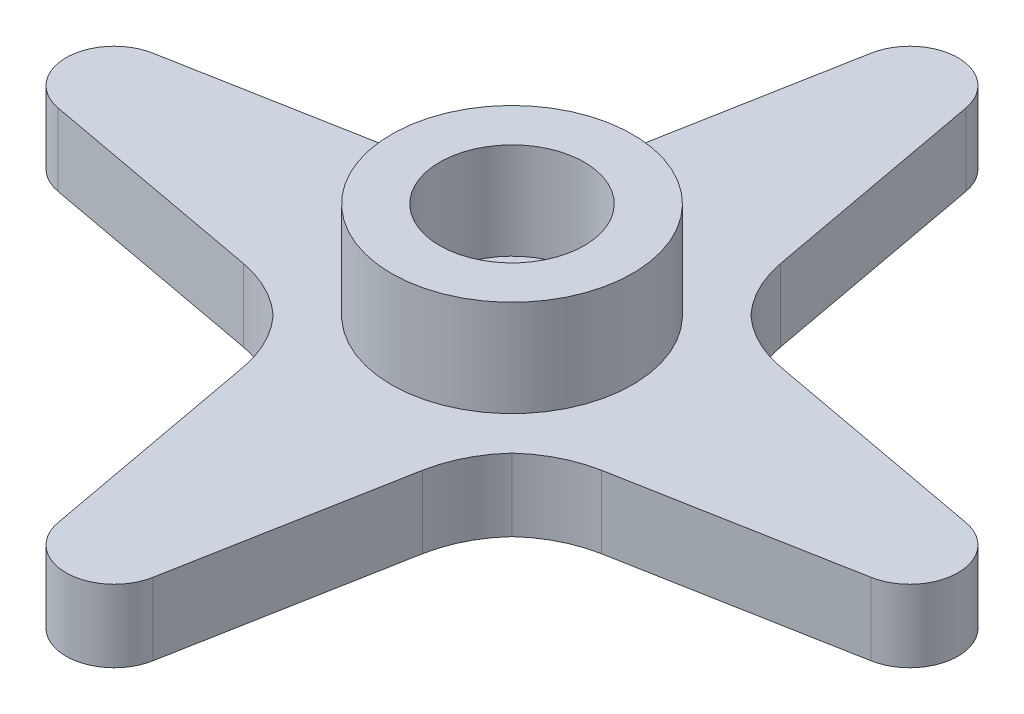
ISO-10303-21;
HEADER;
FILE_DESCRIPTION(('STEP AP214'),'2;1');
FILE_NAME('part.step','',(''),(''),'','','');
FILE_SCHEMA(('AUTOMOTIVE_DESIGN { 1 0 10303 214 1 1 1 1 }'));
ENDSEC;
DATA;
#1=APPLICATION_CONTEXT('core data for automotive mechanical design processes');
#2=APPLICATION_PROTOCOL_DEFINITION('international standard','automotive_design',2000,#1);
#3=PRODUCT_CONTEXT('',#1,'mechanical');
#4=PRODUCT('Part','Part','',(#3));
#5=PRODUCT_RELATED_PRODUCT_CATEGORY('part','',(#4));
#6=PRODUCT_DEFINITION_FORMATION('','',#4);
#7=PRODUCT_DEFINITION_CONTEXT('part definition',#1,'design');
#8=PRODUCT_DEFINITION('design','',#6,#7);
#9=PRODUCT_DEFINITION_SHAPE('','',#8);
#10=(LENGTH_UNIT() NAMED_UNIT(*) SI_UNIT(.MILLI.,.METRE.));
#11=(NAMED_UNIT(*) PLANE_ANGLE_UNIT() SI_UNIT($,.RADIAN.));
#12=(NAMED_UNIT(*) SI_UNIT($,.STERADIAN.) SOLID_ANGLE_UNIT());
#13=UNCERTAINTY_MEASURE_WITH_UNIT(LENGTH_MEASURE(1.E-05),#10,'distance_accuracy_value','');
#14=(GEOMETRIC_REPRESENTATION_CONTEXT(3) GLOBAL_UNCERTAINTY_ASSIGNED_CONTEXT((#13)) GLOBAL_UNIT_ASSIGNED_CONTEXT((#10,
#11,#12)) REPRESENTATION_CONTEXT('',''));
#15=CARTESIAN_POINT('',(0.,0.,0.));
#16=DIRECTION('',(0.,0.,1.));
#17=DIRECTION('',(1.,0.,0.));
#18=AXIS2_PLACEMENT_3D('',#15,#16,#17);
#19=CARTESIAN_POINT('',(-16.8636363636364,3.,-1.96666433207106));
#20=DIRECTION('',(0.181818181818182,0.,0.983332166035633));
#21=DIRECTION('',(0.983332166035634,0.,-0.181818181818182));
#22=AXIS2_PLACEMENT_3D('',#19,#20,#21);
#23=PLANE('',#22);
#24=DIRECTION('',(-0.983332166035634,0.,0.181818181818182));
#25=VECTOR('',#24,1.);
#26=CARTESIAN_POINT('',(-16.8636363636364,3.,-1.96666433207106));
#27=LINE('',#26,#25);
#28=CARTESIAN_POINT('',(-7.43177858714639,3.,-3.71061545186688));
#29=VERTEX_POINT('',#28);
#30=CARTESIAN_POINT('',(-16.8636363636364,3.,-1.96666433207099));
#31=VERTEX_POINT('',#30);
#32=EDGE_CURVE('E173',#29,#31,#27,.T.);
#33=ORIENTED_EDGE('',*,*,#32,.F.);
#34=DIRECTION('',(0.,1.,0.));
#35=VECTOR('',#34,1.);
#36=CARTESIAN_POINT('',(-7.43177858714639,0.,-3.71061545186688));
#37=LINE('',#36,#35);
#38=CARTESIAN_POINT('',(-7.43177858714639,0.,-3.71061545186688));
#39=VERTEX_POINT('',#38);
#40=EDGE_CURVE('E279',#29,#39,#37,.F.);
#41=ORIENTED_EDGE('',*,*,#40,.T.);
#42=DIRECTION('',(-0.983332166035634,0.,0.181818181818182));
#43=VECTOR('',#42,1.);
#44=CARTESIAN_POINT('',(-16.8636363636364,0.,-1.96666433207106));
#45=LINE('',#44,#43);
#46=CARTESIAN_POINT('',(-16.8636363636364,0.,-1.96666433207099));
#47=VERTEX_POINT('',#46);
#48=EDGE_CURVE('E191',#39,#47,#45,.T.);
#49=ORIENTED_EDGE('',*,*,#48,.T.);
#50=DIRECTION('',(0.,-1.,0.));
#51=VECTOR('',#50,1.);
#52=CARTESIAN_POINT('',(-16.8636363636364,3.,-1.96666433207099));
#53=LINE('',#52,#51);
#54=EDGE_CURVE('E189',#31,#47,#53,.T.);
#55=ORIENTED_EDGE('',*,*,#54,.F.);
#56=EDGE_LOOP('',(#33,#41,#49,#55));
#57=FACE_BOUND('',#56,.T.);
#58=ADVANCED_FACE('F37',(#57),#23,.F.);
#59=CARTESIAN_POINT('',(-16.5,3.,2.78852033508202E-13));
#60=DIRECTION('',(0.,-1.,0.));
#61=DIRECTION('',(0.,0.,-1.));
#62=AXIS2_PLACEMENT_3D('',#59,#60,#61);
#63=CYLINDRICAL_SURFACE('',#62,2.00000000000001);
#64=CARTESIAN_POINT('',(-16.5,0.,2.78852033508202E-13));
#65=DIRECTION('',(0.,1.,0.));
#66=DIRECTION('',(0.,0.,1.));
#67=AXIS2_PLACEMENT_3D('',#64,#65,#66);
#68=CIRCLE('',#67,2.00000000000001);
#69=CARTESIAN_POINT('',(-16.8636363636364,0.,1.96666433207147));
#70=VERTEX_POINT('',#69);
#71=EDGE_CURVE('E226',#47,#70,#68,.T.);
#72=ORIENTED_EDGE('',*,*,#71,.T.);
#73=DIRECTION('',(0.,-1.,0.));
#74=VECTOR('',#73,1.);
#75=CARTESIAN_POINT('',(-16.8636363636364,3.,1.96666433207147));
#76=LINE('',#75,#74);
#77=CARTESIAN_POINT('',(-16.8636363636364,3.,1.96666433207147));
#78=VERTEX_POINT('',#77);
#79=EDGE_CURVE('E195',#78,#70,#76,.T.);
#80=ORIENTED_EDGE('',*,*,#79,.F.);
#81=CARTESIAN_POINT('',(-16.5,3.,2.78852033508202E-13));
#82=DIRECTION('',(0.,1.,0.));
#83=DIRECTION('',(0.,0.,1.));
#84=AXIS2_PLACEMENT_3D('',#81,#82,#83);
#85=CIRCLE('',#84,2.00000000000001);
#86=EDGE_CURVE('E179',#31,#78,#85,.T.);
#87=ORIENTED_EDGE('',*,*,#86,.F.);
#88=ORIENTED_EDGE('',*,*,#54,.T.);
#89=EDGE_LOOP('',(#72,#80,#87,#88));
#90=FACE_BOUND('',#89,.T.);
#91=ADVANCED_FACE('F197',(#90),#63,.T.);
#92=CARTESIAN_POINT('',(-16.8636363636364,3.,1.96666433207147));
#93=DIRECTION('',(0.181818181818182,0.,-0.983332166035633));
#94=DIRECTION('',(-0.983332166035634,0.,-0.181818181818182));
#95=AXIS2_PLACEMENT_3D('',#92,#93,#94);
#96=PLANE('',#95);
#97=DIRECTION('',(0.983332166035634,0.,0.181818181818182));
#98=VECTOR('',#97,1.);
#99=CARTESIAN_POINT('',(-16.8636363636364,0.,1.96666433207147));
#100=LINE('',#99,#98);
#101=CARTESIAN_POINT('',(-7.43177858714611,0.,3.71061545186734));
#102=VERTEX_POINT('',#101);
#103=EDGE_CURVE('E229',#70,#102,#100,.T.);
#104=ORIENTED_EDGE('',*,*,#103,.T.);
#105=DIRECTION('',(0.,1.,0.));
#106=VECTOR('',#105,1.);
#107=CARTESIAN_POINT('',(-7.43177858714611,3.,3.71061545186734));
#108=LINE('',#107,#106);
#109=CARTESIAN_POINT('',(-7.43177858714611,3.,3.71061545186734));
#110=VERTEX_POINT('',#109);
#111=EDGE_CURVE('E277',#102,#110,#108,.T.);
#112=ORIENTED_EDGE('',*,*,#111,.T.);
#113=DIRECTION('',(0.983332166035634,0.,0.181818181818182));
#114=VECTOR('',#113,1.);
#115=CARTESIAN_POINT('',(-16.8636363636364,3.,1.96666433207147));
#116=LINE('',#115,#114);
#117=EDGE_CURVE('E200',#78,#110,#116,.T.);
#118=ORIENTED_EDGE('',*,*,#117,.F.);
#119=ORIENTED_EDGE('',*,*,#79,.T.);
#120=EDGE_LOOP('',(#104,#112,#118,#119));
#121=FACE_BOUND('',#120,.T.);
#122=ADVANCED_FACE('F352',(#121),#96,.F.);
#123=CARTESIAN_POINT('',(-1.96666433207099,3.,16.8636363636366));
#124=DIRECTION('',(0.983332166035633,0.,-0.181818181818182));
#125=DIRECTION('',(-0.181818181818182,0.,-0.983332166035634));
#126=AXIS2_PLACEMENT_3D('',#123,#124,#125);
#127=PLANE('',#126);
#128=DIRECTION('',(0.181818181818182,0.,0.983332166035633));
#129=VECTOR('',#128,1.);
#130=CARTESIAN_POINT('',(-1.96666433207099,3.,16.8636363636366));
#131=LINE('',#130,#129);
#132=CARTESIAN_POINT('',(-3.71061545186679,3.,7.43177858714668));
#133=VERTEX_POINT('',#132);
#134=CARTESIAN_POINT('',(-1.96666433207095,3.,16.8636363636366));
#135=VERTEX_POINT('',#134);
#136=EDGE_CURVE('E202',#133,#135,#131,.T.);
#137=ORIENTED_EDGE('',*,*,#136,.F.);
#138=DIRECTION('',(0.,1.,0.));
#139=VECTOR('',#138,1.);
#140=CARTESIAN_POINT('',(-3.71061545186679,0.,7.43177858714668));
#141=LINE('',#140,#139);
#142=CARTESIAN_POINT('',(-3.71061545186679,0.,7.43177858714668));
#143=VERTEX_POINT('',#142);
#144=EDGE_CURVE('E274',#133,#143,#141,.F.);
#145=ORIENTED_EDGE('',*,*,#144,.T.);
#146=DIRECTION('',(0.181818181818182,0.,0.983332166035633));
#147=VECTOR('',#146,1.);
#148=CARTESIAN_POINT('',(-1.96666433207099,0.,16.8636363636366));
#149=LINE('',#148,#147);
#150=CARTESIAN_POINT('',(-1.96666433207095,0.,16.8636363636366));
#151=VERTEX_POINT('',#150);
#152=EDGE_CURVE('E232',#143,#151,#149,.T.);
#153=ORIENTED_EDGE('',*,*,#152,.T.);
#154=DIRECTION('',(0.,-1.,0.));
#155=VECTOR('',#154,1.);
#156=CARTESIAN_POINT('',(-1.96666433207095,3.,16.8636363636366));
#157=LINE('',#156,#155);
#158=EDGE_CURVE('E266',#135,#151,#157,.T.);
#159=ORIENTED_EDGE('',*,*,#158,.F.);
#160=EDGE_LOOP('',(#137,#145,#153,#159));
#161=FACE_BOUND('',#160,.T.);
#162=ADVANCED_FACE('F366',(#161),#127,.F.);
#163=CARTESIAN_POINT('',(3.22944510274302E-13,3.,16.5000000000002));
#164=DIRECTION('',(0.,-1.,0.));
#165=DIRECTION('',(0.,0.,-1.));
#166=AXIS2_PLACEMENT_3D('',#163,#164,#165);
#167=CYLINDRICAL_SURFACE('',#166,2.);
#168=CARTESIAN_POINT('',(3.22944510274302E-13,0.,16.5000000000002));
#169=DIRECTION('',(0.,1.,0.));
#170=DIRECTION('',(0.,0.,1.));
#171=AXIS2_PLACEMENT_3D('',#168,#169,#170);
#172=CIRCLE('',#171,2.);
#173=CARTESIAN_POINT('',(1.96666433207155,0.,16.8636363636366));
#174=VERTEX_POINT('',#173);
#175=EDGE_CURVE('E234',#151,#174,#172,.T.);
#176=ORIENTED_EDGE('',*,*,#175,.T.);
#177=DIRECTION('',(0.,-1.,0.));
#178=VECTOR('',#177,1.);
#179=CARTESIAN_POINT('',(1.96666433207155,3.,16.8636363636366));
#180=LINE('',#179,#178);
#181=CARTESIAN_POINT('',(1.96666433207155,3.,16.8636363636366));
#182=VERTEX_POINT('',#181);
#183=EDGE_CURVE('E263',#182,#174,#180,.T.);
#184=ORIENTED_EDGE('',*,*,#183,.F.);
#185=CARTESIAN_POINT('',(3.22944510274302E-13,3.,16.5000000000002));
#186=DIRECTION('',(0.,1.,0.));
#187=DIRECTION('',(0.,0.,1.));
#188=AXIS2_PLACEMENT_3D('',#185,#186,#187);
#189=CIRCLE('',#188,2.);
#190=EDGE_CURVE('E207',#135,#182,#189,.T.);
#191=ORIENTED_EDGE('',*,*,#190,.F.);
#192=ORIENTED_EDGE('',*,*,#158,.T.);
#193=EDGE_LOOP('',(#176,#184,#191,#192));
#194=FACE_BOUND('',#193,.T.);
#195=ADVANCED_FACE('F372',(#194),#167,.T.);
#196=CARTESIAN_POINT('',(1.96666433207155,3.,16.8636363636366));
#197=DIRECTION('',(-0.983332166035639,0.,-0.181818181818151));
#198=DIRECTION('',(-0.181818181818151,0.,0.983332166035639));
#199=AXIS2_PLACEMENT_3D('',#196,#197,#198);
#200=PLANE('',#199);
#201=DIRECTION('',(0.181818181818151,0.,-0.983332166035639));
#202=VECTOR('',#201,1.);
#203=CARTESIAN_POINT('',(1.96666433207155,0.,16.8636363636366));
#204=LINE('',#203,#202);
#205=CARTESIAN_POINT('',(3.71061545186711,0.,7.43177858714634));
#206=VERTEX_POINT('',#205);
#207=EDGE_CURVE('E236',#174,#206,#204,.T.);
#208=ORIENTED_EDGE('',*,*,#207,.T.);
#209=DIRECTION('',(0.,1.,0.));
#210=VECTOR('',#209,1.);
#211=CARTESIAN_POINT('',(3.71061545186711,3.,7.43177858714634));
#212=LINE('',#211,#210);
#213=CARTESIAN_POINT('',(3.71061545186711,3.,7.43177858714634));
#214=VERTEX_POINT('',#213);
#215=EDGE_CURVE('E272',#206,#214,#212,.T.);
#216=ORIENTED_EDGE('',*,*,#215,.T.);
#217=DIRECTION('',(0.181818181818151,0.,-0.983332166035639));
#218=VECTOR('',#217,1.);
#219=CARTESIAN_POINT('',(1.96666433207155,3.,16.8636363636366));
#220=LINE('',#219,#218);
#221=EDGE_CURVE('E209',#182,#214,#220,.T.);
#222=ORIENTED_EDGE('',*,*,#221,.F.);
#223=ORIENTED_EDGE('',*,*,#183,.T.);
#224=EDGE_LOOP('',(#208,#216,#222,#223));
#225=FACE_BOUND('',#224,.T.);
#226=ADVANCED_FACE('F400',(#225),#200,.F.);
#227=CARTESIAN_POINT('',(16.8636363636364,3.,1.96666433207133));
#228=DIRECTION('',(-0.181818181818178,0.,-0.983332166035634));
#229=DIRECTION('',(-0.983332166035634,0.,0.181818181818178));
#230=AXIS2_PLACEMENT_3D('',#227,#228,#229);
#231=PLANE('',#230);
#232=DIRECTION('',(0.983332166035634,0.,-0.181818181818178));
#233=VECTOR('',#232,1.);
#234=CARTESIAN_POINT('',(16.8636363636364,3.,1.96666433207133));
#235=LINE('',#234,#233);
#236=CARTESIAN_POINT('',(7.4317785871462,3.,3.71061545186714));
#237=VERTEX_POINT('',#236);
#238=CARTESIAN_POINT('',(16.8636363636364,3.,1.96666433207133));
#239=VERTEX_POINT('',#238);
#240=EDGE_CURVE('E212',#237,#239,#235,.T.);
#241=ORIENTED_EDGE('',*,*,#240,.F.);
#242=DIRECTION('',(0.,1.,0.));
#243=VECTOR('',#242,1.);
#244=CARTESIAN_POINT('',(7.43177858714621,0.,3.71061545186714));
#245=LINE('',#244,#243);
#246=CARTESIAN_POINT('',(7.4317785871462,0.,3.71061545186714));
#247=VERTEX_POINT('',#246);
#248=EDGE_CURVE('E194',#237,#247,#245,.F.);
#249=ORIENTED_EDGE('',*,*,#248,.T.);
#250=DIRECTION('',(0.983332166035634,0.,-0.181818181818178));
#251=VECTOR('',#250,1.);
#252=CARTESIAN_POINT('',(16.8636363636364,0.,1.96666433207133));
#253=LINE('',#252,#251);
#254=CARTESIAN_POINT('',(16.8636363636364,0.,1.96666433207133));
#255=VERTEX_POINT('',#254);
#256=EDGE_CURVE('E239',#247,#255,#253,.T.);
#257=ORIENTED_EDGE('',*,*,#256,.T.);
#258=DIRECTION('',(0.,-1.,0.));
#259=VECTOR('',#258,1.);
#260=CARTESIAN_POINT('',(16.8636363636364,3.,1.96666433207133));
#261=LINE('',#260,#259);
#262=EDGE_CURVE('E260',#239,#255,#261,.T.);
#263=ORIENTED_EDGE('',*,*,#262,.F.);
#264=EDGE_LOOP('',(#241,#249,#257,#263));
#265=FACE_BOUND('',#264,.T.);
#266=ADVANCED_FACE('F388',(#265),#231,.F.);
#267=CARTESIAN_POINT('',(16.5,3.,0.));
#268=DIRECTION('',(0.,-1.,0.));
#269=DIRECTION('',(0.,0.,-1.));
#270=AXIS2_PLACEMENT_3D('',#267,#268,#269);
#271=CYLINDRICAL_SURFACE('',#270,2.);
#272=CARTESIAN_POINT('',(16.5,0.,0.));
#273=DIRECTION('',(0.,1.,0.));
#274=DIRECTION('',(0.,0.,1.));
#275=AXIS2_PLACEMENT_3D('',#272,#273,#274);
#276=CIRCLE('',#275,2.);
#277=CARTESIAN_POINT('',(16.8636363636364,0.,-1.96666433207121));
#278=VERTEX_POINT('',#277);
#279=EDGE_CURVE('E241',#255,#278,#276,.T.);
#280=ORIENTED_EDGE('',*,*,#279,.T.);
#281=DIRECTION('',(0.,-1.,0.));
#282=VECTOR('',#281,1.);
#283=CARTESIAN_POINT('',(16.8636363636364,3.,-1.96666433207121));
#284=LINE('',#283,#282);
#285=CARTESIAN_POINT('',(16.8636363636364,3.,-1.96666433207121));
#286=VERTEX_POINT('',#285);
#287=EDGE_CURVE('E257',#286,#278,#284,.T.);
#288=ORIENTED_EDGE('',*,*,#287,.F.);
#289=CARTESIAN_POINT('',(16.5,3.,0.));
#290=DIRECTION('',(0.,1.,0.));
#291=DIRECTION('',(0.,0.,1.));
#292=AXIS2_PLACEMENT_3D('',#289,#290,#291);
#293=CIRCLE('',#292,2.);
#294=EDGE_CURVE('E214',#239,#286,#293,.T.);
#295=ORIENTED_EDGE('',*,*,#294,.F.);
#296=ORIENTED_EDGE('',*,*,#262,.T.);
#297=EDGE_LOOP('',(#280,#288,#295,#296));
#298=FACE_BOUND('',#297,.T.);
#299=ADVANCED_FACE('F394',(#298),#271,.T.);
#300=CARTESIAN_POINT('',(16.8636363636364,3.,-1.96666433207121));
#301=DIRECTION('',(-0.181818181818185,0.,0.983332166035633));
#302=DIRECTION('',(0.983332166035633,0.,0.181818181818185));
#303=AXIS2_PLACEMENT_3D('',#300,#301,#302);
#304=PLANE('',#303);
#305=DIRECTION('',(-0.983332166035633,0.,-0.181818181818185));
#306=VECTOR('',#305,1.);
#307=CARTESIAN_POINT('',(16.8636363636364,0.,-1.96666433207121));
#308=LINE('',#307,#306);
#309=CARTESIAN_POINT('',(7.43177858714623,0.,-3.71061545186709));
#310=VERTEX_POINT('',#309);
#311=EDGE_CURVE('E243',#278,#310,#308,.T.);
#312=ORIENTED_EDGE('',*,*,#311,.T.);
#313=DIRECTION('',(0.,1.,0.));
#314=VECTOR('',#313,1.);
#315=CARTESIAN_POINT('',(7.43177858714623,3.,-3.71061545186709));
#316=LINE('',#315,#314);
#317=CARTESIAN_POINT('',(7.43177858714623,3.,-3.71061545186709));
#318=VERTEX_POINT('',#317);
#319=EDGE_CURVE('E283',#310,#318,#316,.T.);
#320=ORIENTED_EDGE('',*,*,#319,.T.);
#321=DIRECTION('',(-0.983332166035633,0.,-0.181818181818185));
#322=VECTOR('',#321,1.);
#323=CARTESIAN_POINT('',(16.8636363636364,3.,-1.96666433207121));
#324=LINE('',#323,#322);
#325=EDGE_CURVE('E216',#286,#318,#324,.T.);
#326=ORIENTED_EDGE('',*,*,#325,.F.);
#327=ORIENTED_EDGE('',*,*,#287,.T.);
#328=EDGE_LOOP('',(#312,#320,#326,#327));
#329=FACE_BOUND('',#328,.T.);
#330=ADVANCED_FACE('F397',(#329),#304,.F.);
#331=CARTESIAN_POINT('',(1.96666433207127,3.,-16.8636363636364));
#332=DIRECTION('',(-0.983332166035633,0.,0.181818181818182));
#333=DIRECTION('',(0.181818181818182,0.,0.983332166035634));
#334=AXIS2_PLACEMENT_3D('',#331,#332,#333);
#335=PLANE('',#334);
#336=DIRECTION('',(-0.181818181818182,0.,-0.983332166035634));
#337=VECTOR('',#336,1.);
#338=CARTESIAN_POINT('',(1.96666433207127,3.,-16.8636363636364));
#339=LINE('',#338,#337);
#340=CARTESIAN_POINT('',(3.71061545186711,3.,-7.43177858714622));
#341=VERTEX_POINT('',#340);
#342=CARTESIAN_POINT('',(1.96666433207127,3.,-16.8636363636364));
#343=VERTEX_POINT('',#342);
#344=EDGE_CURVE('E218',#341,#343,#339,.T.);
#345=ORIENTED_EDGE('',*,*,#344,.F.);
#346=DIRECTION('',(0.,1.,0.));
#347=VECTOR('',#346,1.);
#348=CARTESIAN_POINT('',(3.71061545186711,0.,-7.43177858714622));
#349=LINE('',#348,#347);
#350=CARTESIAN_POINT('',(3.71061545186711,0.,-7.43177858714622));
#351=VERTEX_POINT('',#350);
#352=EDGE_CURVE('E286',#341,#351,#349,.F.);
#353=ORIENTED_EDGE('',*,*,#352,.T.);
#354=DIRECTION('',(-0.181818181818182,0.,-0.983332166035634));
#355=VECTOR('',#354,1.);
#356=CARTESIAN_POINT('',(1.96666433207127,0.,-16.8636363636364));
#357=LINE('',#356,#355);
#358=CARTESIAN_POINT('',(1.96666433207127,0.,-16.8636363636364));
#359=VERTEX_POINT('',#358);
#360=EDGE_CURVE('E246',#351,#359,#357,.T.);
#361=ORIENTED_EDGE('',*,*,#360,.T.);
#362=DIRECTION('',(0.,-1.,0.));
#363=VECTOR('',#362,1.);
#364=CARTESIAN_POINT('',(1.96666433207127,3.,-16.8636363636364));
#365=LINE('',#364,#363);
#366=EDGE_CURVE('E254',#343,#359,#365,.T.);
#367=ORIENTED_EDGE('',*,*,#366,.F.);
#368=EDGE_LOOP('',(#345,#353,#361,#367));
#369=FACE_BOUND('',#368,.T.);
#370=ADVANCED_FACE('F335',(#369),#335,.F.);
#371=CARTESIAN_POINT('',(0.,3.,-16.5));
#372=DIRECTION('',(0.,-1.,0.));
#373=DIRECTION('',(0.,0.,-1.));
#374=AXIS2_PLACEMENT_3D('',#371,#372,#373);
#375=CYLINDRICAL_SURFACE('',#374,2.);
#376=CARTESIAN_POINT('',(0.,0.,-16.5));
#377=DIRECTION('',(0.,1.,0.));
#378=DIRECTION('',(0.,0.,1.));
#379=AXIS2_PLACEMENT_3D('',#376,#377,#378);
#380=CIRCLE('',#379,2.);
#381=CARTESIAN_POINT('',(-1.96666433207127,0.,-16.8636363636364));
#382=VERTEX_POINT('',#381);
#383=EDGE_CURVE('E248',#359,#382,#380,.T.);
#384=ORIENTED_EDGE('',*,*,#383,.T.);
#385=DIRECTION('',(0.,-1.,0.));
#386=VECTOR('',#385,1.);
#387=CARTESIAN_POINT('',(-1.96666433207127,3.,-16.8636363636364));
#388=LINE('',#387,#386);
#389=CARTESIAN_POINT('',(-1.96666433207127,3.,-16.8636363636364));
#390=VERTEX_POINT('',#389);
#391=EDGE_CURVE('E224',#390,#382,#388,.T.);
#392=ORIENTED_EDGE('',*,*,#391,.F.);
#393=CARTESIAN_POINT('',(0.,3.,-16.5));
#394=DIRECTION('',(0.,1.,0.));
#395=DIRECTION('',(0.,0.,1.));
#396=AXIS2_PLACEMENT_3D('',#393,#394,#395);
#397=CIRCLE('',#396,2.);
#398=EDGE_CURVE('E220',#343,#390,#397,.T.);
#399=ORIENTED_EDGE('',*,*,#398,.F.);
#400=ORIENTED_EDGE('',*,*,#366,.T.);
#401=EDGE_LOOP('',(#384,#392,#399,#400));
#402=FACE_BOUND('',#401,.T.);
#403=ADVANCED_FACE('F340',(#402),#375,.T.);
#404=CARTESIAN_POINT('',(-1.96666433207127,3.,-16.8636363636364));
#405=DIRECTION('',(0.983332166035633,0.,0.181818181818182));
#406=DIRECTION('',(0.181818181818182,0.,-0.983332166035634));
#407=AXIS2_PLACEMENT_3D('',#404,#405,#406);
#408=PLANE('',#407);
#409=DIRECTION('',(-0.181818181818182,0.,0.983332166035634));
#410=VECTOR('',#409,1.);
#411=CARTESIAN_POINT('',(-1.96666433207127,0.,-16.8636363636364));
#412=LINE('',#411,#410);
#413=CARTESIAN_POINT('',(-3.71061545186713,0.,-7.43177858714613));
#414=VERTEX_POINT('',#413);
#415=EDGE_CURVE('E186',#382,#414,#412,.T.);
#416=ORIENTED_EDGE('',*,*,#415,.T.);
#417=DIRECTION('',(0.,1.,0.));
#418=VECTOR('',#417,1.);
#419=CARTESIAN_POINT('',(-3.71061545186713,3.,-7.43177858714613));
#420=LINE('',#419,#418);
#421=CARTESIAN_POINT('',(-3.71061545186713,3.,-7.43177858714613));
#422=VERTEX_POINT('',#421);
#423=EDGE_CURVE('E281',#414,#422,#420,.T.);
#424=ORIENTED_EDGE('',*,*,#423,.T.);
#425=DIRECTION('',(-0.181818181818182,0.,0.983332166035634));
#426=VECTOR('',#425,1.);
#427=CARTESIAN_POINT('',(-1.96666433207127,3.,-16.8636363636364));
#428=LINE('',#427,#426);
#429=EDGE_CURVE('E222',#390,#422,#428,.T.);
#430=ORIENTED_EDGE('',*,*,#429,.F.);
#431=ORIENTED_EDGE('',*,*,#391,.T.);
#432=EDGE_LOOP('',(#416,#424,#430,#431));
#433=FACE_BOUND('',#432,.T.);
#434=ADVANCED_FACE('F503',(#433),#408,.F.);
#435=CARTESIAN_POINT('',(0.,3.,0.));
#436=DIRECTION('',(0.,1.,0.));
#437=DIRECTION('',(0.,0.,1.));
#438=AXIS2_PLACEMENT_3D('',#435,#436,#437);
#439=PLANE('',#438);
#440=CARTESIAN_POINT('',(0.,3.,0.));
#441=DIRECTION('',(0.,1.,0.));
#442=DIRECTION('',(0.,0.,1.));
#443=AXIS2_PLACEMENT_3D('',#440,#441,#442);
#444=CIRCLE('',#443,5.);
#445=CARTESIAN_POINT('',(0.,3.,5.));
#446=VERTEX_POINT('',#445);
#447=EDGE_CURVE('E620',#446,#446,#444,.T.);
#448=ORIENTED_EDGE('',*,*,#447,.F.);
#449=EDGE_LOOP('',(#448));
#450=FACE_BOUND('',#449,.T.);
#451=ORIENTED_EDGE('',*,*,#429,.T.);
#452=CARTESIAN_POINT('',(-8.62727628204529,3.,-8.34086949623704));
#453=DIRECTION('',(0.,1.,0.));
#454=DIRECTION('',(0.,0.,1.));
#455=AXIS2_PLACEMENT_3D('',#452,#453,#454);
#456=CIRCLE('',#455,5.);
#457=CARTESIAN_POINT('',(-4.95144033136499,3.,-4.95144033136484));
#458=VERTEX_POINT('',#457);
#459=EDGE_CURVE('E309',#422,#458,#456,.F.);
#460=ORIENTED_EDGE('',*,*,#459,.T.);
#461=CARTESIAN_POINT('',(-8.3408694962373,3.,-8.62727628204504));
#462=DIRECTION('',(0.,1.,0.));
#463=DIRECTION('',(0.,0.,1.));
#464=AXIS2_PLACEMENT_3D('',#461,#462,#463);
#465=CIRCLE('',#464,5.);
#466=EDGE_CURVE('E182',#458,#29,#465,.F.);
#467=ORIENTED_EDGE('',*,*,#466,.T.);
#468=ORIENTED_EDGE('',*,*,#32,.T.);
#469=ORIENTED_EDGE('',*,*,#86,.T.);
#470=ORIENTED_EDGE('',*,*,#117,.T.);
#471=CARTESIAN_POINT('',(-8.34086949623702,3.,8.62727628204551));
#472=DIRECTION('',(0.,1.,0.));
#473=DIRECTION('',(0.,0.,1.));
#474=AXIS2_PLACEMENT_3D('',#471,#472,#473);
#475=CIRCLE('',#474,5.);
#476=CARTESIAN_POINT('',(-4.95144033136484,3.,4.95144033136519));
#477=VERTEX_POINT('',#476);
#478=EDGE_CURVE('E302',#110,#477,#475,.F.);
#479=ORIENTED_EDGE('',*,*,#478,.T.);
#480=CARTESIAN_POINT('',(-8.62727628204496,3.,8.34086949623759));
#481=DIRECTION('',(0.,1.,0.));
#482=DIRECTION('',(0.,0.,1.));
#483=AXIS2_PLACEMENT_3D('',#480,#481,#482);
#484=CIRCLE('',#483,5.);
#485=EDGE_CURVE('E298',#477,#133,#484,.F.);
#486=ORIENTED_EDGE('',*,*,#485,.T.);
#487=ORIENTED_EDGE('',*,*,#136,.T.);
#488=ORIENTED_EDGE('',*,*,#190,.T.);
#489=ORIENTED_EDGE('',*,*,#221,.T.);
#490=CARTESIAN_POINT('',(8.62727628204531,3.,8.3408694962371));
#491=DIRECTION('',(0.,1.,0.));
#492=DIRECTION('',(0.,0.,1.));
#493=AXIS2_PLACEMENT_3D('',#490,#491,#492);
#494=CIRCLE('',#493,5.);
#495=CARTESIAN_POINT('',(4.95144033136494,3.,4.95144033136497));
#496=VERTEX_POINT('',#495);
#497=EDGE_CURVE('E294',#214,#496,#494,.F.);
#498=ORIENTED_EDGE('',*,*,#497,.T.);
#499=CARTESIAN_POINT('',(8.3408694962371,3.,8.62727628204531));
#500=DIRECTION('',(0.,1.,0.));
#501=DIRECTION('',(0.,0.,1.));
#502=AXIS2_PLACEMENT_3D('',#499,#500,#501);
#503=CIRCLE('',#502,5.);
#504=EDGE_CURVE('E290',#496,#237,#503,.F.);
#505=ORIENTED_EDGE('',*,*,#504,.T.);
#506=ORIENTED_EDGE('',*,*,#240,.T.);
#507=ORIENTED_EDGE('',*,*,#294,.T.);
#508=ORIENTED_EDGE('',*,*,#325,.T.);
#509=CARTESIAN_POINT('',(8.34086949623716,3.,-8.62727628204525));
#510=DIRECTION('',(0.,1.,0.));
#511=DIRECTION('',(0.,0.,1.));
#512=AXIS2_PLACEMENT_3D('',#509,#510,#511);
#513=CIRCLE('',#512,5.);
#514=CARTESIAN_POINT('',(4.95144033136497,3.,-4.95144033136494));
#515=VERTEX_POINT('',#514);
#516=EDGE_CURVE('E53',#318,#515,#513,.F.);
#517=ORIENTED_EDGE('',*,*,#516,.T.);
#518=CARTESIAN_POINT('',(8.62727628204527,3.,-8.34086949623713));
#519=DIRECTION('',(0.,1.,0.));
#520=DIRECTION('',(0.,0.,1.));
#521=AXIS2_PLACEMENT_3D('',#518,#519,#520);
#522=CIRCLE('',#521,5.);
#523=EDGE_CURVE('E11',#515,#341,#522,.F.);
#524=ORIENTED_EDGE('',*,*,#523,.T.);
#525=ORIENTED_EDGE('',*,*,#344,.T.);
#526=ORIENTED_EDGE('',*,*,#398,.T.);
#527=EDGE_LOOP('',(#451,#460,#467,#468,#469,#470,#479,#486,#487,#488,#489,#498,#505,#506,#507,
#508,#517,#524,#525,#526));
#528=FACE_BOUND('',#527,.T.);
#529=ADVANCED_FACE('F176',(#450,#528),#439,.T.);
#530=CARTESIAN_POINT('',(0.,0.,0.));
#531=DIRECTION('',(0.,1.,0.));
#532=DIRECTION('',(0.,0.,1.));
#533=AXIS2_PLACEMENT_3D('',#530,#531,#532);
#534=PLANE('',#533);
#535=CARTESIAN_POINT('',(-8.3408694962373,0.,-8.62727628204504));
#536=DIRECTION('',(0.,1.,0.));
#537=DIRECTION('',(0.,0.,1.));
#538=AXIS2_PLACEMENT_3D('',#535,#536,#537);
#539=CIRCLE('',#538,5.);
#540=CARTESIAN_POINT('',(-4.95144033136499,0.,-4.95144033136484));
#541=VERTEX_POINT('',#540);
#542=EDGE_CURVE('E304',#39,#541,#539,.T.);
#543=ORIENTED_EDGE('',*,*,#542,.T.);
#544=CARTESIAN_POINT('',(-8.62727628204529,0.,-8.34086949623704));
#545=DIRECTION('',(0.,1.,0.));
#546=DIRECTION('',(0.,0.,1.));
#547=AXIS2_PLACEMENT_3D('',#544,#545,#546);
#548=CIRCLE('',#547,5.);
#549=EDGE_CURVE('E307',#541,#414,#548,.T.);
#550=ORIENTED_EDGE('',*,*,#549,.T.);
#551=ORIENTED_EDGE('',*,*,#415,.F.);
#552=ORIENTED_EDGE('',*,*,#383,.F.);
#553=ORIENTED_EDGE('',*,*,#360,.F.);
#554=CARTESIAN_POINT('',(8.62727628204527,0.,-8.34086949623713));
#555=DIRECTION('',(0.,1.,0.));
#556=DIRECTION('',(0.,0.,1.));
#557=AXIS2_PLACEMENT_3D('',#554,#555,#556);
#558=CIRCLE('',#557,5.);
#559=CARTESIAN_POINT('',(4.95144033136497,0.,-4.95144033136494));
#560=VERTEX_POINT('',#559);
#561=EDGE_CURVE('E46',#351,#560,#558,.T.);
#562=ORIENTED_EDGE('',*,*,#561,.T.);
#563=CARTESIAN_POINT('',(8.34086949623716,0.,-8.62727628204525));
#564=DIRECTION('',(0.,1.,0.));
#565=DIRECTION('',(0.,0.,1.));
#566=AXIS2_PLACEMENT_3D('',#563,#564,#565);
#567=CIRCLE('',#566,5.);
#568=EDGE_CURVE('E311',#560,#310,#567,.T.);
#569=ORIENTED_EDGE('',*,*,#568,.T.);
#570=ORIENTED_EDGE('',*,*,#311,.F.);
#571=ORIENTED_EDGE('',*,*,#279,.F.);
#572=ORIENTED_EDGE('',*,*,#256,.F.);
#573=CARTESIAN_POINT('',(8.3408694962371,0.,8.62727628204531));
#574=DIRECTION('',(0.,1.,0.));
#575=DIRECTION('',(0.,0.,1.));
#576=AXIS2_PLACEMENT_3D('',#573,#574,#575);
#577=CIRCLE('',#576,5.);
#578=CARTESIAN_POINT('',(4.95144033136494,0.,4.95144033136497));
#579=VERTEX_POINT('',#578);
#580=EDGE_CURVE('E288',#247,#579,#577,.T.);
#581=ORIENTED_EDGE('',*,*,#580,.T.);
#582=CARTESIAN_POINT('',(8.62727628204531,0.,8.3408694962371));
#583=DIRECTION('',(0.,1.,0.));
#584=DIRECTION('',(0.,0.,1.));
#585=AXIS2_PLACEMENT_3D('',#582,#583,#584);
#586=CIRCLE('',#585,5.);
#587=EDGE_CURVE('E292',#579,#206,#586,.T.);
#588=ORIENTED_EDGE('',*,*,#587,.T.);
#589=ORIENTED_EDGE('',*,*,#207,.F.);
#590=ORIENTED_EDGE('',*,*,#175,.F.);
#591=ORIENTED_EDGE('',*,*,#152,.F.);
#592=CARTESIAN_POINT('',(-8.62727628204496,0.,8.34086949623759));
#593=DIRECTION('',(0.,1.,0.));
#594=DIRECTION('',(0.,0.,1.));
#595=AXIS2_PLACEMENT_3D('',#592,#593,#594);
#596=CIRCLE('',#595,5.);
#597=CARTESIAN_POINT('',(-4.95144033136484,0.,4.95144033136519));
#598=VERTEX_POINT('',#597);
#599=EDGE_CURVE('E296',#143,#598,#596,.T.);
#600=ORIENTED_EDGE('',*,*,#599,.T.);
#601=CARTESIAN_POINT('',(-8.34086949623702,0.,8.62727628204551));
#602=DIRECTION('',(0.,1.,0.));
#603=DIRECTION('',(0.,0.,1.));
#604=AXIS2_PLACEMENT_3D('',#601,#602,#603);
#605=CIRCLE('',#604,5.);
#606=EDGE_CURVE('E300',#598,#102,#605,.T.);
#607=ORIENTED_EDGE('',*,*,#606,.T.);
#608=ORIENTED_EDGE('',*,*,#103,.F.);
#609=ORIENTED_EDGE('',*,*,#71,.F.);
#610=ORIENTED_EDGE('',*,*,#48,.F.);
#611=EDGE_LOOP('',(#543,#550,#551,#552,#553,#562,#569,#570,#571,#572,#581,#588,#589,#590,#591,
#600,#607,#608,#609,#610));
#612=FACE_BOUND('',#611,.T.);
#613=ADVANCED_FACE('F349',(#612),#534,.F.);
#614=CARTESIAN_POINT('',(0.,7.,0.));
#615=DIRECTION('',(0.,-1.,0.));
#616=DIRECTION('',(0.,0.,-1.));
#617=AXIS2_PLACEMENT_3D('',#614,#615,#616);
#618=CYLINDRICAL_SURFACE('',#617,5.);
#619=CARTESIAN_POINT('',(0.,7.,0.));
#620=DIRECTION('',(0.,1.,0.));
#621=DIRECTION('',(0.,0.,1.));
#622=AXIS2_PLACEMENT_3D('',#619,#620,#621);
#623=CIRCLE('',#622,5.);
#624=CARTESIAN_POINT('',(0.,7.,5.));
#625=VERTEX_POINT('',#624);
#626=EDGE_CURVE('E227',#625,#625,#623,.T.);
#627=ORIENTED_EDGE('',*,*,#626,.F.);
#628=EDGE_LOOP('',(#627));
#629=FACE_BOUND('',#628,.T.);
#630=ORIENTED_EDGE('',*,*,#447,.T.);
#631=EDGE_LOOP('',(#630));
#632=FACE_BOUND('',#631,.T.);
#633=ADVANCED_FACE('F482',(#629,#632),#618,.T.);
#634=CARTESIAN_POINT('',(0.,7.,0.));
#635=DIRECTION('',(0.,1.,0.));
#636=DIRECTION('',(0.,0.,1.));
#637=AXIS2_PLACEMENT_3D('',#634,#635,#636);
#638=PLANE('',#637);
#639=CARTESIAN_POINT('',(0.,7.,0.));
#640=DIRECTION('',(0.,1.,0.));
#641=DIRECTION('',(0.,0.,1.));
#642=AXIS2_PLACEMENT_3D('',#639,#640,#641);
#643=CIRCLE('',#642,3.);
#644=CARTESIAN_POINT('',(0.,7.,3.));
#645=VERTEX_POINT('',#644);
#646=EDGE_CURVE('E318',#645,#645,#643,.T.);
#647=ORIENTED_EDGE('',*,*,#646,.F.);
#648=EDGE_LOOP('',(#647));
#649=FACE_BOUND('',#648,.T.);
#650=ORIENTED_EDGE('',*,*,#626,.T.);
#651=EDGE_LOOP('',(#650));
#652=FACE_BOUND('',#651,.T.);
#653=ADVANCED_FACE('F474',(#649,#652),#638,.T.);
#654=CARTESIAN_POINT('',(0.,3.,0.));
#655=DIRECTION('',(0.,1.,0.));
#656=DIRECTION('',(0.,0.,1.));
#657=AXIS2_PLACEMENT_3D('',#654,#655,#656);
#658=CYLINDRICAL_SURFACE('',#657,3.);
#659=CARTESIAN_POINT('',(0.,3.,0.));
#660=DIRECTION('',(0.,1.,0.));
#661=DIRECTION('',(0.,0.,1.));
#662=AXIS2_PLACEMENT_3D('',#659,#660,#661);
#663=CIRCLE('',#662,3.);
#664=CARTESIAN_POINT('',(0.,3.,3.));
#665=VERTEX_POINT('',#664);
#666=EDGE_CURVE('E622',#665,#665,#663,.T.);
#667=ORIENTED_EDGE('',*,*,#666,.F.);
#668=EDGE_LOOP('',(#667));
#669=FACE_BOUND('',#668,.T.);
#670=ORIENTED_EDGE('',*,*,#646,.T.);
#671=EDGE_LOOP('',(#670));
#672=FACE_BOUND('',#671,.T.);
#673=ADVANCED_FACE('F466',(#669,#672),#658,.F.);
#674=CARTESIAN_POINT('',(0.,3.,0.));
#675=DIRECTION('',(0.,1.,0.));
#676=DIRECTION('',(0.,0.,1.));
#677=AXIS2_PLACEMENT_3D('',#674,#675,#676);
#678=PLANE('',#677);
#679=ORIENTED_EDGE('',*,*,#666,.T.);
#680=EDGE_LOOP('',(#679));
#681=FACE_BOUND('',#680,.T.);
#682=ADVANCED_FACE('F421',(#681),#678,.T.);
#683=CARTESIAN_POINT('',(8.62727628204531,3.,8.3408694962371));
#684=DIRECTION('',(0.,-1.,0.));
#685=DIRECTION('',(0.,0.,-1.));
#686=AXIS2_PLACEMENT_3D('',#683,#684,#685);
#687=CYLINDRICAL_SURFACE('',#686,5.);
#688=DIRECTION('',(0.,-1.,0.));
#689=VECTOR('',#688,1.);
#690=CARTESIAN_POINT('',(4.95144033136494,1.5,4.95144033136497));
#691=LINE('',#690,#689);
#692=EDGE_CURVE('E315',#496,#579,#691,.T.);
#693=ORIENTED_EDGE('',*,*,#692,.F.);
#694=ORIENTED_EDGE('',*,*,#497,.F.);
#695=ORIENTED_EDGE('',*,*,#215,.F.);
#696=ORIENTED_EDGE('',*,*,#587,.F.);
#697=EDGE_LOOP('',(#693,#694,#695,#696));
#698=FACE_BOUND('',#697,.T.);
#699=ADVANCED_FACE('F379',(#698),#687,.F.);
#700=CARTESIAN_POINT('',(8.3408694962371,3.,8.62727628204531));
#701=DIRECTION('',(0.,-1.,0.));
#702=DIRECTION('',(0.,0.,-1.));
#703=AXIS2_PLACEMENT_3D('',#700,#701,#702);
#704=CYLINDRICAL_SURFACE('',#703,5.);
#705=ORIENTED_EDGE('',*,*,#504,.F.);
#706=ORIENTED_EDGE('',*,*,#692,.T.);
#707=ORIENTED_EDGE('',*,*,#580,.F.);
#708=ORIENTED_EDGE('',*,*,#248,.F.);
#709=EDGE_LOOP('',(#705,#706,#707,#708));
#710=FACE_BOUND('',#709,.T.);
#711=ADVANCED_FACE('F384',(#710),#704,.F.);
#712=CARTESIAN_POINT('',(-8.34086949623702,3.,8.62727628204551));
#713=DIRECTION('',(0.,-1.,0.));
#714=DIRECTION('',(0.,0.,-1.));
#715=AXIS2_PLACEMENT_3D('',#712,#713,#714);
#716=CYLINDRICAL_SURFACE('',#715,5.);
#717=DIRECTION('',(0.,-1.,0.));
#718=VECTOR('',#717,1.);
#719=CARTESIAN_POINT('',(-4.95144033136484,1.5,4.95144033136519));
#720=LINE('',#719,#718);
#721=EDGE_CURVE('E319',#477,#598,#720,.T.);
#722=ORIENTED_EDGE('',*,*,#721,.F.);
#723=ORIENTED_EDGE('',*,*,#478,.F.);
#724=ORIENTED_EDGE('',*,*,#111,.F.);
#725=ORIENTED_EDGE('',*,*,#606,.F.);
#726=EDGE_LOOP('',(#722,#723,#724,#725));
#727=FACE_BOUND('',#726,.T.);
#728=ADVANCED_FACE('F357',(#727),#716,.F.);
#729=CARTESIAN_POINT('',(-8.62727628204496,3.,8.34086949623759));
#730=DIRECTION('',(0.,-1.,0.));
#731=DIRECTION('',(0.,0.,-1.));
#732=AXIS2_PLACEMENT_3D('',#729,#730,#731);
#733=CYLINDRICAL_SURFACE('',#732,5.);
#734=ORIENTED_EDGE('',*,*,#485,.F.);
#735=ORIENTED_EDGE('',*,*,#721,.T.);
#736=ORIENTED_EDGE('',*,*,#599,.F.);
#737=ORIENTED_EDGE('',*,*,#144,.F.);
#738=EDGE_LOOP('',(#734,#735,#736,#737));
#739=FACE_BOUND('',#738,.T.);
#740=ADVANCED_FACE('F362',(#739),#733,.F.);
#741=CARTESIAN_POINT('',(-8.62727628204529,3.,-8.34086949623704));
#742=DIRECTION('',(0.,-1.,0.));
#743=DIRECTION('',(0.,0.,-1.));
#744=AXIS2_PLACEMENT_3D('',#741,#742,#743);
#745=CYLINDRICAL_SURFACE('',#744,5.);
#746=DIRECTION('',(0.,-1.,0.));
#747=VECTOR('',#746,1.);
#748=CARTESIAN_POINT('',(-4.95144033136499,1.5,-4.95144033136484));
#749=LINE('',#748,#747);
#750=EDGE_CURVE('E321',#458,#541,#749,.T.);
#751=ORIENTED_EDGE('',*,*,#750,.F.);
#752=ORIENTED_EDGE('',*,*,#459,.F.);
#753=ORIENTED_EDGE('',*,*,#423,.F.);
#754=ORIENTED_EDGE('',*,*,#549,.F.);
#755=EDGE_LOOP('',(#751,#752,#753,#754));
#756=FACE_BOUND('',#755,.T.);
#757=ADVANCED_FACE('F346',(#756),#745,.F.);
#758=CARTESIAN_POINT('',(-8.3408694962373,3.,-8.62727628204504));
#759=DIRECTION('',(0.,-1.,0.));
#760=DIRECTION('',(0.,0.,-1.));
#761=AXIS2_PLACEMENT_3D('',#758,#759,#760);
#762=CYLINDRICAL_SURFACE('',#761,5.);
#763=ORIENTED_EDGE('',*,*,#466,.F.);
#764=ORIENTED_EDGE('',*,*,#750,.T.);
#765=ORIENTED_EDGE('',*,*,#542,.F.);
#766=ORIENTED_EDGE('',*,*,#40,.F.);
#767=EDGE_LOOP('',(#763,#764,#765,#766));
#768=FACE_BOUND('',#767,.T.);
#769=ADVANCED_FACE('F348',(#768),#762,.F.);
#770=CARTESIAN_POINT('',(8.62727628204527,3.,-8.34086949623713));
#771=DIRECTION('',(0.,-1.,0.));
#772=DIRECTION('',(0.,0.,-1.));
#773=AXIS2_PLACEMENT_3D('',#770,#771,#772);
#774=CYLINDRICAL_SURFACE('',#773,5.);
#775=ORIENTED_EDGE('',*,*,#352,.F.);
#776=ORIENTED_EDGE('',*,*,#523,.F.);
#777=DIRECTION('',(0.,-1.,0.));
#778=VECTOR('',#777,1.);
#779=CARTESIAN_POINT('',(4.95144033136497,1.5,-4.95144033136494));
#780=LINE('',#779,#778);
#781=EDGE_CURVE('E41',#560,#515,#780,.F.);
#782=ORIENTED_EDGE('',*,*,#781,.F.);
#783=ORIENTED_EDGE('',*,*,#561,.F.);
#784=EDGE_LOOP('',(#775,#776,#782,#783));
#785=FACE_BOUND('',#784,.T.);
#786=ADVANCED_FACE('F39',(#785),#774,.F.);
#787=CARTESIAN_POINT('',(8.34086949623716,3.,-8.62727628204525));
#788=DIRECTION('',(0.,-1.,0.));
#789=DIRECTION('',(0.,0.,-1.));
#790=AXIS2_PLACEMENT_3D('',#787,#788,#789);
#791=CYLINDRICAL_SURFACE('',#790,5.);
#792=ORIENTED_EDGE('',*,*,#516,.F.);
#793=ORIENTED_EDGE('',*,*,#319,.F.);
#794=ORIENTED_EDGE('',*,*,#568,.F.);
#795=ORIENTED_EDGE('',*,*,#781,.T.);
#796=EDGE_LOOP('',(#792,#793,#794,#795));
#797=FACE_BOUND('',#796,.T.);
#798=ADVANCED_FACE('F328',(#797),#791,.F.);
#799=CLOSED_SHELL('',(#58,#91,#122,#162,#195,#226,#266,#299,#330,#370,#403,#434,#529,#613,#633,
#653,#673,#682,#699,#711,#728,#740,#757,#769,#786,#798));
#800=MANIFOLD_SOLID_BREP('B2',#799);
#801=ADVANCED_BREP_SHAPE_REPRESENTATION('',(#18,#800),#14);
#802=SHAPE_DEFINITION_REPRESENTATION(#9,#801);
ENDSEC;
END-ISO-10303-21;
